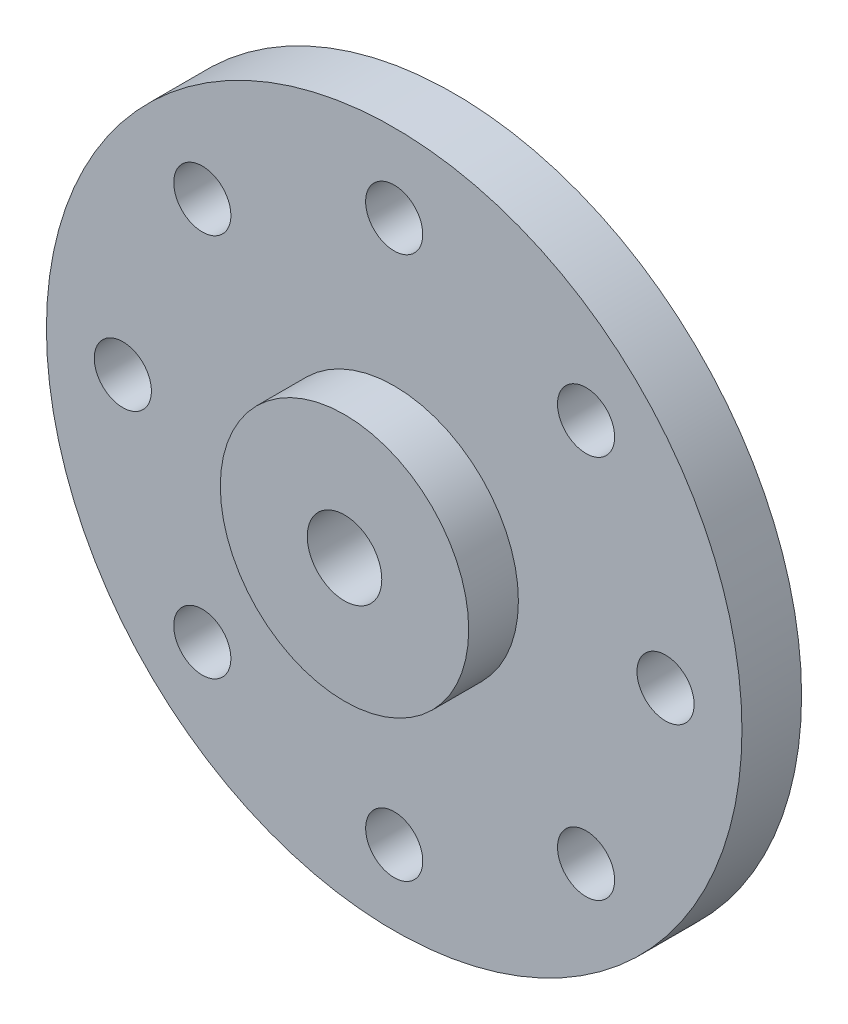
ISO-10303-21;
HEADER;
FILE_DESCRIPTION(('STEP AP214'),'2;1');
FILE_NAME('part.step','',(''),(''),'','','');
FILE_SCHEMA(('AUTOMOTIVE_DESIGN { 1 0 10303 214 1 1 1 1 }'));
ENDSEC;
DATA;
#1=APPLICATION_CONTEXT('core data for automotive mechanical design processes');
#2=APPLICATION_PROTOCOL_DEFINITION('international standard','automotive_design',2000,#1);
#3=PRODUCT_CONTEXT('',#1,'mechanical');
#4=PRODUCT('Part','Part','',(#3));
#5=PRODUCT_RELATED_PRODUCT_CATEGORY('part','',(#4));
#6=PRODUCT_DEFINITION_FORMATION('','',#4);
#7=PRODUCT_DEFINITION_CONTEXT('part definition',#1,'design');
#8=PRODUCT_DEFINITION('design','',#6,#7);
#9=PRODUCT_DEFINITION_SHAPE('','',#8);
#10=(LENGTH_UNIT() NAMED_UNIT(*) SI_UNIT(.MILLI.,.METRE.));
#11=(NAMED_UNIT(*) PLANE_ANGLE_UNIT() SI_UNIT($,.RADIAN.));
#12=(NAMED_UNIT(*) SI_UNIT($,.STERADIAN.) SOLID_ANGLE_UNIT());
#13=UNCERTAINTY_MEASURE_WITH_UNIT(LENGTH_MEASURE(1.E-05),#10,'distance_accuracy_value','');
#14=(GEOMETRIC_REPRESENTATION_CONTEXT(3) GLOBAL_UNCERTAINTY_ASSIGNED_CONTEXT((#13)) GLOBAL_UNIT_ASSIGNED_CONTEXT((#10,
#11,#12)) REPRESENTATION_CONTEXT('',''));
#15=CARTESIAN_POINT('',(0.,0.,0.));
#16=DIRECTION('',(0.,0.,1.));
#17=DIRECTION('',(1.,0.,0.));
#18=AXIS2_PLACEMENT_3D('',#15,#16,#17);
#19=CARTESIAN_POINT('',(0.,0.,2.4));
#20=DIRECTION('',(0.,0.,-1.));
#21=DIRECTION('',(-1.,0.,0.));
#22=AXIS2_PLACEMENT_3D('',#19,#20,#21);
#23=CYLINDRICAL_SURFACE('',#22,14.);
#24=CARTESIAN_POINT('',(0.,0.,2.4));
#25=DIRECTION('',(0.,0.,1.));
#26=DIRECTION('',(1.,0.,0.));
#27=AXIS2_PLACEMENT_3D('',#24,#25,#26);
#28=CIRCLE('',#27,14.);
#29=CARTESIAN_POINT('',(14.,0.,2.4));
#30=VERTEX_POINT('',#29);
#31=EDGE_CURVE('E10',#30,#30,#28,.T.);
#32=ORIENTED_EDGE('',*,*,#31,.F.);
#33=EDGE_LOOP('',(#32));
#34=FACE_BOUND('',#33,.T.);
#35=CARTESIAN_POINT('',(0.,0.,0.));
#36=DIRECTION('',(0.,0.,1.));
#37=DIRECTION('',(1.,0.,0.));
#38=AXIS2_PLACEMENT_3D('',#35,#36,#37);
#39=CIRCLE('',#38,14.);
#40=CARTESIAN_POINT('',(14.,0.,0.));
#41=VERTEX_POINT('',#40);
#42=EDGE_CURVE('E38',#41,#41,#39,.T.);
#43=ORIENTED_EDGE('',*,*,#42,.T.);
#44=EDGE_LOOP('',(#43));
#45=FACE_BOUND('',#44,.T.);
#46=ADVANCED_FACE('F35',(#34,#45),#23,.T.);
#47=CARTESIAN_POINT('',(0.,0.,2.4));
#48=DIRECTION('',(0.,0.,1.));
#49=DIRECTION('',(1.,0.,0.));
#50=AXIS2_PLACEMENT_3D('',#47,#48,#49);
#51=PLANE('',#50);
#52=CARTESIAN_POINT('',(0.,0.,2.4));
#53=DIRECTION('',(0.,0.,1.));
#54=DIRECTION('',(1.,0.,0.));
#55=AXIS2_PLACEMENT_3D('',#52,#53,#54);
#56=CIRCLE('',#55,5.);
#57=CARTESIAN_POINT('',(5.,0.,2.4));
#58=VERTEX_POINT('',#57);
#59=EDGE_CURVE('E95',#58,#58,#56,.T.);
#60=ORIENTED_EDGE('',*,*,#59,.F.);
#61=EDGE_LOOP('',(#60));
#62=FACE_BOUND('',#61,.T.);
#63=CARTESIAN_POINT('',(-10.9237071567079,-0.0737071567079266,2.4));
#64=DIRECTION('',(0.,0.,1.));
#65=DIRECTION('',(0.,1.,0.));
#66=AXIS2_PLACEMENT_3D('',#63,#64,#65);
#67=CIRCLE('',#66,1.15);
#68=CARTESIAN_POINT('',(-10.9237071567079,1.07629284329207,2.4));
#69=VERTEX_POINT('',#68);
#70=EDGE_CURVE('E78',#69,#69,#67,.T.);
#71=ORIENTED_EDGE('',*,*,#70,.F.);
#72=EDGE_LOOP('',(#71));
#73=FACE_BOUND('',#72,.T.);
#74=CARTESIAN_POINT('',(-7.72422740620413,-7.7979345629121,2.4));
#75=DIRECTION('',(0.,0.,1.));
#76=DIRECTION('',(-0.707106781186551,0.707106781186544,0.));
#77=AXIS2_PLACEMENT_3D('',#74,#75,#76);
#78=CIRCLE('',#77,1.15);
#79=CARTESIAN_POINT('',(-8.53740020456866,-6.98476176454757,2.4));
#80=VERTEX_POINT('',#79);
#81=EDGE_CURVE('E72',#80,#80,#78,.T.);
#82=ORIENTED_EDGE('',*,*,#81,.F.);
#83=EDGE_LOOP('',(#82));
#84=FACE_BOUND('',#83,.T.);
#85=CARTESIAN_POINT('',(0.,-10.9974143134158,2.4));
#86=DIRECTION('',(0.,0.,1.));
#87=DIRECTION('',(-1.,0.,0.));
#88=AXIS2_PLACEMENT_3D('',#85,#86,#87);
#89=CIRCLE('',#88,1.15);
#90=CARTESIAN_POINT('',(-1.15,-10.9974143134158,2.4));
#91=VERTEX_POINT('',#90);
#92=EDGE_CURVE('E66',#91,#91,#89,.T.);
#93=ORIENTED_EDGE('',*,*,#92,.F.);
#94=EDGE_LOOP('',(#93));
#95=FACE_BOUND('',#94,.T.);
#96=CARTESIAN_POINT('',(7.72422740620424,-7.79793456291199,2.4));
#97=DIRECTION('',(0.,0.,1.));
#98=DIRECTION('',(-0.707106781186541,-0.707106781186554,0.));
#99=AXIS2_PLACEMENT_3D('',#96,#97,#98);
#100=CIRCLE('',#99,1.15);
#101=CARTESIAN_POINT('',(6.91105460783971,-8.61110736127653,2.4));
#102=VERTEX_POINT('',#101);
#103=EDGE_CURVE('E59',#102,#102,#100,.T.);
#104=ORIENTED_EDGE('',*,*,#103,.F.);
#105=EDGE_LOOP('',(#104));
#106=FACE_BOUND('',#105,.T.);
#107=CARTESIAN_POINT('',(10.9237071567079,-0.0737071567077744,2.4));
#108=DIRECTION('',(0.,0.,1.));
#109=DIRECTION('',(0.,-1.,0.));
#110=AXIS2_PLACEMENT_3D('',#107,#108,#109);
#111=CIRCLE('',#110,1.15);
#112=CARTESIAN_POINT('',(10.9237071567079,-1.22370715670777,2.4));
#113=VERTEX_POINT('',#112);
#114=EDGE_CURVE('E90',#113,#113,#111,.T.);
#115=ORIENTED_EDGE('',*,*,#114,.F.);
#116=EDGE_LOOP('',(#115));
#117=FACE_BOUND('',#116,.T.);
#118=CARTESIAN_POINT('',(7.72422740620407,7.65052024949637,2.4));
#119=DIRECTION('',(0.,0.,1.));
#120=DIRECTION('',(0.707106781186556,-0.707106781186539,0.));
#121=AXIS2_PLACEMENT_3D('',#118,#119,#120);
#122=CIRCLE('',#121,1.15);
#123=CARTESIAN_POINT('',(8.53740020456861,6.83734745113185,2.4));
#124=VERTEX_POINT('',#123);
#125=EDGE_CURVE('E83',#124,#124,#122,.T.);
#126=ORIENTED_EDGE('',*,*,#125,.F.);
#127=EDGE_LOOP('',(#126));
#128=FACE_BOUND('',#127,.T.);
#129=CARTESIAN_POINT('',(-7.72422740620418,7.65052024949627,2.4));
#130=DIRECTION('',(0.,0.,1.));
#131=DIRECTION('',(0.707106781186546,0.707106781186549,0.));
#132=AXIS2_PLACEMENT_3D('',#129,#130,#131);
#133=CIRCLE('',#132,1.15);
#134=CARTESIAN_POINT('',(-6.91105460783965,8.4636930478608,2.4));
#135=VERTEX_POINT('',#134);
#136=EDGE_CURVE('E53',#135,#135,#133,.T.);
#137=ORIENTED_EDGE('',*,*,#136,.F.);
#138=EDGE_LOOP('',(#137));
#139=FACE_BOUND('',#138,.T.);
#140=CARTESIAN_POINT('',(0.,10.85,2.4));
#141=DIRECTION('',(0.,0.,1.));
#142=DIRECTION('',(1.,0.,0.));
#143=AXIS2_PLACEMENT_3D('',#140,#141,#142);
#144=CIRCLE('',#143,1.15);
#145=CARTESIAN_POINT('',(1.15,10.85,2.4));
#146=VERTEX_POINT('',#145);
#147=EDGE_CURVE('E47',#146,#146,#144,.T.);
#148=ORIENTED_EDGE('',*,*,#147,.F.);
#149=EDGE_LOOP('',(#148));
#150=FACE_BOUND('',#149,.T.);
#151=ORIENTED_EDGE('',*,*,#31,.T.);
#152=EDGE_LOOP('',(#151));
#153=FACE_BOUND('',#152,.T.);
#154=ADVANCED_FACE('F129',(#62,#73,#84,#95,#106,#117,#128,#139,#150,#153),#51,.T.);
#155=CARTESIAN_POINT('',(0.,0.,0.));
#156=DIRECTION('',(0.,0.,1.));
#157=DIRECTION('',(1.,0.,0.));
#158=AXIS2_PLACEMENT_3D('',#155,#156,#157);
#159=PLANE('',#158);
#160=CARTESIAN_POINT('',(0.,0.,0.));
#161=DIRECTION('',(0.,0.,1.));
#162=DIRECTION('',(1.,0.,0.));
#163=AXIS2_PLACEMENT_3D('',#160,#161,#162);
#164=CIRCLE('',#163,1.5);
#165=CARTESIAN_POINT('',(1.5,0.,0.));
#166=VERTEX_POINT('',#165);
#167=EDGE_CURVE('E98',#166,#166,#164,.T.);
#168=ORIENTED_EDGE('',*,*,#167,.T.);
#169=EDGE_LOOP('',(#168));
#170=FACE_BOUND('',#169,.T.);
#171=CARTESIAN_POINT('',(-10.9237071567079,-0.0737071567079266,0.));
#172=DIRECTION('',(0.,0.,1.));
#173=DIRECTION('',(0.,1.,0.));
#174=AXIS2_PLACEMENT_3D('',#171,#172,#173);
#175=CIRCLE('',#174,1.15);
#176=CARTESIAN_POINT('',(-10.9237071567079,1.07629284329207,0.));
#177=VERTEX_POINT('',#176);
#178=EDGE_CURVE('E56',#177,#177,#175,.T.);
#179=ORIENTED_EDGE('',*,*,#178,.T.);
#180=EDGE_LOOP('',(#179));
#181=FACE_BOUND('',#180,.T.);
#182=CARTESIAN_POINT('',(-7.72422740620413,-7.7979345629121,0.));
#183=DIRECTION('',(0.,0.,1.));
#184=DIRECTION('',(-0.707106781186551,0.707106781186544,0.));
#185=AXIS2_PLACEMENT_3D('',#182,#183,#184);
#186=CIRCLE('',#185,1.15);
#187=CARTESIAN_POINT('',(-8.53740020456866,-6.98476176454757,0.));
#188=VERTEX_POINT('',#187);
#189=EDGE_CURVE('E75',#188,#188,#186,.T.);
#190=ORIENTED_EDGE('',*,*,#189,.T.);
#191=EDGE_LOOP('',(#190));
#192=FACE_BOUND('',#191,.T.);
#193=CARTESIAN_POINT('',(0.,-10.9974143134158,0.));
#194=DIRECTION('',(0.,0.,1.));
#195=DIRECTION('',(-1.,0.,0.));
#196=AXIS2_PLACEMENT_3D('',#193,#194,#195);
#197=CIRCLE('',#196,1.15);
#198=CARTESIAN_POINT('',(-1.15,-10.9974143134158,0.));
#199=VERTEX_POINT('',#198);
#200=EDGE_CURVE('E69',#199,#199,#197,.T.);
#201=ORIENTED_EDGE('',*,*,#200,.T.);
#202=EDGE_LOOP('',(#201));
#203=FACE_BOUND('',#202,.T.);
#204=CARTESIAN_POINT('',(7.72422740620424,-7.79793456291199,0.));
#205=DIRECTION('',(0.,0.,1.));
#206=DIRECTION('',(-0.707106781186541,-0.707106781186554,0.));
#207=AXIS2_PLACEMENT_3D('',#204,#205,#206);
#208=CIRCLE('',#207,1.15);
#209=CARTESIAN_POINT('',(6.91105460783971,-8.61110736127653,0.));
#210=VERTEX_POINT('',#209);
#211=EDGE_CURVE('E62',#210,#210,#208,.T.);
#212=ORIENTED_EDGE('',*,*,#211,.T.);
#213=EDGE_LOOP('',(#212));
#214=FACE_BOUND('',#213,.T.);
#215=CARTESIAN_POINT('',(10.9237071567079,-0.0737071567077744,0.));
#216=DIRECTION('',(0.,0.,1.));
#217=DIRECTION('',(0.,-1.,0.));
#218=AXIS2_PLACEMENT_3D('',#215,#216,#217);
#219=CIRCLE('',#218,1.15);
#220=CARTESIAN_POINT('',(10.9237071567079,-1.22370715670777,0.));
#221=VERTEX_POINT('',#220);
#222=EDGE_CURVE('E63',#221,#221,#219,.T.);
#223=ORIENTED_EDGE('',*,*,#222,.T.);
#224=EDGE_LOOP('',(#223));
#225=FACE_BOUND('',#224,.T.);
#226=CARTESIAN_POINT('',(7.72422740620407,7.65052024949637,0.));
#227=DIRECTION('',(0.,0.,1.));
#228=DIRECTION('',(0.707106781186556,-0.707106781186539,0.));
#229=AXIS2_PLACEMENT_3D('',#226,#227,#228);
#230=CIRCLE('',#229,1.15);
#231=CARTESIAN_POINT('',(8.53740020456861,6.83734745113185,0.));
#232=VERTEX_POINT('',#231);
#233=EDGE_CURVE('E86',#232,#232,#230,.T.);
#234=ORIENTED_EDGE('',*,*,#233,.T.);
#235=EDGE_LOOP('',(#234));
#236=FACE_BOUND('',#235,.T.);
#237=CARTESIAN_POINT('',(-7.72422740620418,7.65052024949627,0.));
#238=DIRECTION('',(0.,0.,1.));
#239=DIRECTION('',(0.707106781186546,0.707106781186549,0.));
#240=AXIS2_PLACEMENT_3D('',#237,#238,#239);
#241=CIRCLE('',#240,1.15);
#242=CARTESIAN_POINT('',(-6.91105460783965,8.4636930478608,0.));
#243=VERTEX_POINT('',#242);
#244=EDGE_CURVE('E50',#243,#243,#241,.T.);
#245=ORIENTED_EDGE('',*,*,#244,.T.);
#246=EDGE_LOOP('',(#245));
#247=FACE_BOUND('',#246,.T.);
#248=CARTESIAN_POINT('',(0.,10.85,0.));
#249=DIRECTION('',(0.,0.,1.));
#250=DIRECTION('',(1.,0.,0.));
#251=AXIS2_PLACEMENT_3D('',#248,#249,#250);
#252=CIRCLE('',#251,1.15);
#253=CARTESIAN_POINT('',(1.15,10.85,0.));
#254=VERTEX_POINT('',#253);
#255=EDGE_CURVE('E45',#254,#254,#252,.T.);
#256=ORIENTED_EDGE('',*,*,#255,.T.);
#257=EDGE_LOOP('',(#256));
#258=FACE_BOUND('',#257,.T.);
#259=ORIENTED_EDGE('',*,*,#42,.F.);
#260=EDGE_LOOP('',(#259));
#261=FACE_BOUND('',#260,.T.);
#262=ADVANCED_FACE('F107',(#170,#181,#192,#203,#214,#225,#236,#247,#258,#261),#159,.F.);
#263=CARTESIAN_POINT('',(0.,10.85,0.));
#264=DIRECTION('',(0.,0.,1.));
#265=DIRECTION('',(1.,0.,0.));
#266=AXIS2_PLACEMENT_3D('',#263,#264,#265);
#267=CYLINDRICAL_SURFACE('',#266,1.15);
#268=ORIENTED_EDGE('',*,*,#255,.F.);
#269=EDGE_LOOP('',(#268));
#270=FACE_BOUND('',#269,.T.);
#271=ORIENTED_EDGE('',*,*,#147,.T.);
#272=EDGE_LOOP('',(#271));
#273=FACE_BOUND('',#272,.T.);
#274=ADVANCED_FACE('F149',(#270,#273),#267,.F.);
#275=CARTESIAN_POINT('',(-7.72422740620418,7.65052024949627,0.));
#276=DIRECTION('',(0.,0.,1.));
#277=DIRECTION('',(1.,0.,0.));
#278=AXIS2_PLACEMENT_3D('',#275,#276,#277);
#279=CYLINDRICAL_SURFACE('',#278,1.15);
#280=ORIENTED_EDGE('',*,*,#244,.F.);
#281=EDGE_LOOP('',(#280));
#282=FACE_BOUND('',#281,.T.);
#283=ORIENTED_EDGE('',*,*,#136,.T.);
#284=EDGE_LOOP('',(#283));
#285=FACE_BOUND('',#284,.T.);
#286=ADVANCED_FACE('F151',(#282,#285),#279,.F.);
#287=CARTESIAN_POINT('',(7.72422740620407,7.65052024949637,0.));
#288=DIRECTION('',(0.,0.,1.));
#289=DIRECTION('',(1.,0.,0.));
#290=AXIS2_PLACEMENT_3D('',#287,#288,#289);
#291=CYLINDRICAL_SURFACE('',#290,1.15);
#292=ORIENTED_EDGE('',*,*,#233,.F.);
#293=EDGE_LOOP('',(#292));
#294=FACE_BOUND('',#293,.T.);
#295=ORIENTED_EDGE('',*,*,#125,.T.);
#296=EDGE_LOOP('',(#295));
#297=FACE_BOUND('',#296,.T.);
#298=ADVANCED_FACE('F158',(#294,#297),#291,.F.);
#299=CARTESIAN_POINT('',(10.9237071567079,-0.0737071567077744,0.));
#300=DIRECTION('',(0.,0.,1.));
#301=DIRECTION('',(1.,0.,0.));
#302=AXIS2_PLACEMENT_3D('',#299,#300,#301);
#303=CYLINDRICAL_SURFACE('',#302,1.15);
#304=ORIENTED_EDGE('',*,*,#222,.F.);
#305=EDGE_LOOP('',(#304));
#306=FACE_BOUND('',#305,.T.);
#307=ORIENTED_EDGE('',*,*,#114,.T.);
#308=EDGE_LOOP('',(#307));
#309=FACE_BOUND('',#308,.T.);
#310=ADVANCED_FACE('F241',(#306,#309),#303,.F.);
#311=CARTESIAN_POINT('',(7.72422740620424,-7.79793456291199,0.));
#312=DIRECTION('',(0.,0.,1.));
#313=DIRECTION('',(1.,0.,0.));
#314=AXIS2_PLACEMENT_3D('',#311,#312,#313);
#315=CYLINDRICAL_SURFACE('',#314,1.15);
#316=ORIENTED_EDGE('',*,*,#211,.F.);
#317=EDGE_LOOP('',(#316));
#318=FACE_BOUND('',#317,.T.);
#319=ORIENTED_EDGE('',*,*,#103,.T.);
#320=EDGE_LOOP('',(#319));
#321=FACE_BOUND('',#320,.T.);
#322=ADVANCED_FACE('F231',(#318,#321),#315,.F.);
#323=CARTESIAN_POINT('',(0.,-10.9974143134158,0.));
#324=DIRECTION('',(0.,0.,1.));
#325=DIRECTION('',(1.,0.,0.));
#326=AXIS2_PLACEMENT_3D('',#323,#324,#325);
#327=CYLINDRICAL_SURFACE('',#326,1.15);
#328=ORIENTED_EDGE('',*,*,#200,.F.);
#329=EDGE_LOOP('',(#328));
#330=FACE_BOUND('',#329,.T.);
#331=ORIENTED_EDGE('',*,*,#92,.T.);
#332=EDGE_LOOP('',(#331));
#333=FACE_BOUND('',#332,.T.);
#334=ADVANCED_FACE('F221',(#330,#333),#327,.F.);
#335=CARTESIAN_POINT('',(-7.72422740620413,-7.7979345629121,0.));
#336=DIRECTION('',(0.,0.,1.));
#337=DIRECTION('',(1.,0.,0.));
#338=AXIS2_PLACEMENT_3D('',#335,#336,#337);
#339=CYLINDRICAL_SURFACE('',#338,1.15);
#340=ORIENTED_EDGE('',*,*,#189,.F.);
#341=EDGE_LOOP('',(#340));
#342=FACE_BOUND('',#341,.T.);
#343=ORIENTED_EDGE('',*,*,#81,.T.);
#344=EDGE_LOOP('',(#343));
#345=FACE_BOUND('',#344,.T.);
#346=ADVANCED_FACE('F212',(#342,#345),#339,.F.);
#347=CARTESIAN_POINT('',(-10.9237071567079,-0.0737071567079266,0.));
#348=DIRECTION('',(0.,0.,1.));
#349=DIRECTION('',(1.,0.,0.));
#350=AXIS2_PLACEMENT_3D('',#347,#348,#349);
#351=CYLINDRICAL_SURFACE('',#350,1.15);
#352=ORIENTED_EDGE('',*,*,#178,.F.);
#353=EDGE_LOOP('',(#352));
#354=FACE_BOUND('',#353,.T.);
#355=ORIENTED_EDGE('',*,*,#70,.T.);
#356=EDGE_LOOP('',(#355));
#357=FACE_BOUND('',#356,.T.);
#358=ADVANCED_FACE('F125',(#354,#357),#351,.F.);
#359=CARTESIAN_POINT('',(0.,0.,4.4));
#360=DIRECTION('',(0.,0.,-1.));
#361=DIRECTION('',(-1.,0.,0.));
#362=AXIS2_PLACEMENT_3D('',#359,#360,#361);
#363=CYLINDRICAL_SURFACE('',#362,5.);
#364=CARTESIAN_POINT('',(0.,0.,4.4));
#365=DIRECTION('',(0.,0.,1.));
#366=DIRECTION('',(1.,0.,0.));
#367=AXIS2_PLACEMENT_3D('',#364,#365,#366);
#368=CIRCLE('',#367,5.);
#369=CARTESIAN_POINT('',(5.,0.,4.4));
#370=VERTEX_POINT('',#369);
#371=EDGE_CURVE('E87',#370,#370,#368,.T.);
#372=ORIENTED_EDGE('',*,*,#371,.F.);
#373=EDGE_LOOP('',(#372));
#374=FACE_BOUND('',#373,.T.);
#375=ORIENTED_EDGE('',*,*,#59,.T.);
#376=EDGE_LOOP('',(#375));
#377=FACE_BOUND('',#376,.T.);
#378=ADVANCED_FACE('F119',(#374,#377),#363,.T.);
#379=CARTESIAN_POINT('',(0.,0.,4.4));
#380=DIRECTION('',(0.,0.,1.));
#381=DIRECTION('',(1.,0.,0.));
#382=AXIS2_PLACEMENT_3D('',#379,#380,#381);
#383=PLANE('',#382);
#384=CARTESIAN_POINT('',(0.,0.,4.4));
#385=DIRECTION('',(0.,0.,1.));
#386=DIRECTION('',(1.,0.,0.));
#387=AXIS2_PLACEMENT_3D('',#384,#385,#386);
#388=CIRCLE('',#387,1.5);
#389=CARTESIAN_POINT('',(1.5,0.,4.4));
#390=VERTEX_POINT('',#389);
#391=EDGE_CURVE('E101',#390,#390,#388,.T.);
#392=ORIENTED_EDGE('',*,*,#391,.F.);
#393=EDGE_LOOP('',(#392));
#394=FACE_BOUND('',#393,.T.);
#395=ORIENTED_EDGE('',*,*,#371,.T.);
#396=EDGE_LOOP('',(#395));
#397=FACE_BOUND('',#396,.T.);
#398=ADVANCED_FACE('F113',(#394,#397),#383,.T.);
#399=CARTESIAN_POINT('',(0.,0.,0.));
#400=DIRECTION('',(0.,0.,1.));
#401=DIRECTION('',(1.,0.,0.));
#402=AXIS2_PLACEMENT_3D('',#399,#400,#401);
#403=CYLINDRICAL_SURFACE('',#402,1.5);
#404=ORIENTED_EDGE('',*,*,#167,.F.);
#405=EDGE_LOOP('',(#404));
#406=FACE_BOUND('',#405,.T.);
#407=ORIENTED_EDGE('',*,*,#391,.T.);
#408=EDGE_LOOP('',(#407));
#409=FACE_BOUND('',#408,.T.);
#410=ADVANCED_FACE('F110',(#406,#409),#403,.F.);
#411=CLOSED_SHELL('',(#46,#154,#262,#274,#286,#298,#310,#322,#334,#346,#358,#378,#398,#410));
#412=MANIFOLD_SOLID_BREP('B2',#411);
#413=ADVANCED_BREP_SHAPE_REPRESENTATION('',(#18,#412),#14);
#414=SHAPE_DEFINITION_REPRESENTATION(#9,#413);
ENDSEC;
END-ISO-10303-21;
